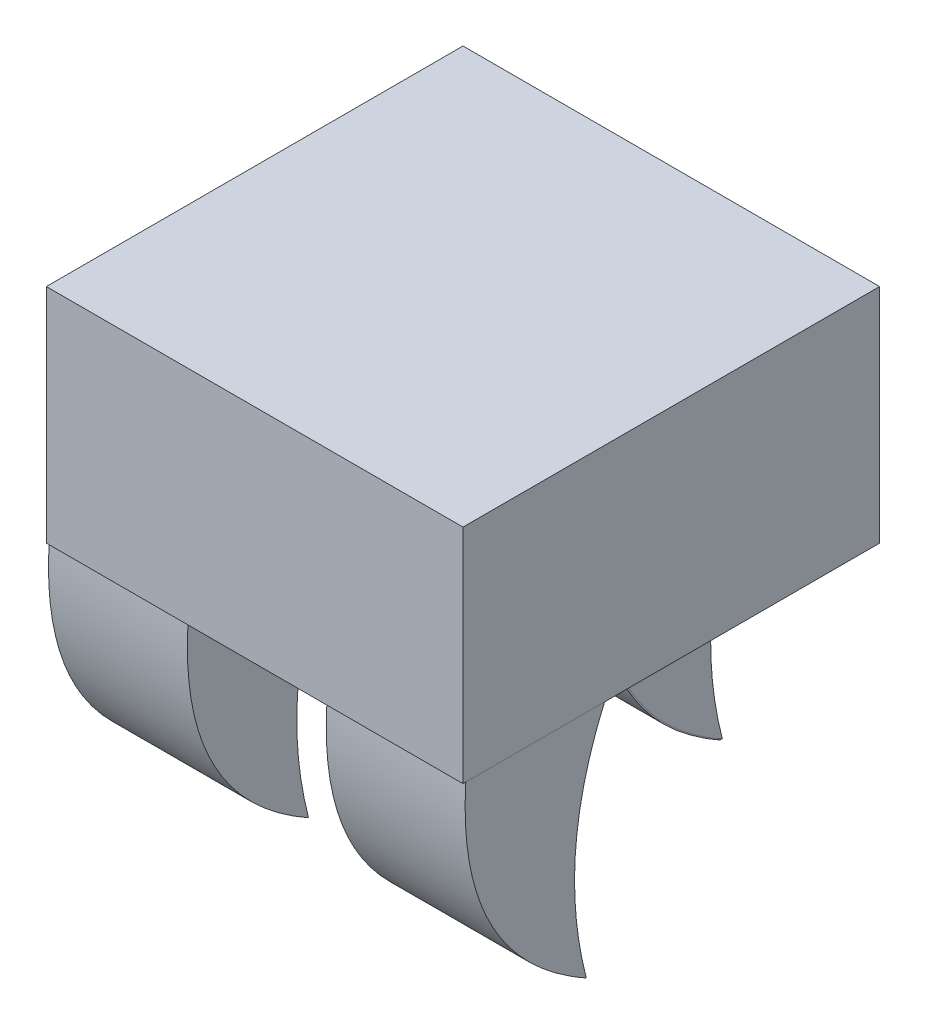
ISO-10303-21;
HEADER;
FILE_DESCRIPTION(('STEP AP214'),'2;1');
FILE_NAME('part.step','',(''),(''),'','','');
FILE_SCHEMA(('AUTOMOTIVE_DESIGN { 1 0 10303 214 1 1 1 1 }'));
ENDSEC;
DATA;
#1=APPLICATION_CONTEXT('core data for automotive mechanical design processes');
#2=APPLICATION_PROTOCOL_DEFINITION('international standard','automotive_design',2000,#1);
#3=PRODUCT_CONTEXT('',#1,'mechanical');
#4=PRODUCT('Part','Part','',(#3));
#5=PRODUCT_RELATED_PRODUCT_CATEGORY('part','',(#4));
#6=PRODUCT_DEFINITION_FORMATION('','',#4);
#7=PRODUCT_DEFINITION_CONTEXT('part definition',#1,'design');
#8=PRODUCT_DEFINITION('design','',#6,#7);
#9=PRODUCT_DEFINITION_SHAPE('','',#8);
#10=(LENGTH_UNIT() NAMED_UNIT(*) SI_UNIT(.MILLI.,.METRE.));
#11=(NAMED_UNIT(*) PLANE_ANGLE_UNIT() SI_UNIT($,.RADIAN.));
#12=(NAMED_UNIT(*) SI_UNIT($,.STERADIAN.) SOLID_ANGLE_UNIT());
#13=UNCERTAINTY_MEASURE_WITH_UNIT(LENGTH_MEASURE(1.E-05),#10,'distance_accuracy_value','');
#14=(GEOMETRIC_REPRESENTATION_CONTEXT(3) GLOBAL_UNCERTAINTY_ASSIGNED_CONTEXT((#13)) GLOBAL_UNIT_ASSIGNED_CONTEXT((#10,
#11,#12)) REPRESENTATION_CONTEXT('',''));
#15=CARTESIAN_POINT('',(0.,0.,0.));
#16=DIRECTION('',(0.,0.,1.));
#17=DIRECTION('',(1.,0.,0.));
#18=AXIS2_PLACEMENT_3D('',#15,#16,#17);
#19=CARTESIAN_POINT('',(0.,-4.,0.));
#20=DIRECTION('',(0.,-1.,0.));
#21=DIRECTION('',(0.,0.,-1.));
#22=AXIS2_PLACEMENT_3D('',#19,#20,#21);
#23=PLANE('',#22);
#24=DIRECTION('',(0.,0.,1.));
#25=VECTOR('',#24,1.);
#26=CARTESIAN_POINT('',(-7.5,-4.,7.50000000000001));
#27=LINE('',#26,#25);
#28=CARTESIAN_POINT('',(-7.5,-4.,7.4000004032366));
#29=VERTEX_POINT('',#28);
#30=CARTESIAN_POINT('',(-7.5,-4.,7.50000000000001));
#31=VERTEX_POINT('',#30);
#32=EDGE_CURVE('E332',#29,#31,#27,.T.);
#33=ORIENTED_EDGE('',*,*,#32,.F.);
#34=DIRECTION('',(-1.,0.,0.));
#35=VECTOR('',#34,1.);
#36=CARTESIAN_POINT('',(-2.50004012317898,-4.,7.4000004032366));
#37=LINE('',#36,#35);
#38=CARTESIAN_POINT('',(-2.50004012317898,-4.,7.4000004032366));
#39=VERTEX_POINT('',#38);
#40=EDGE_CURVE('E612',#39,#29,#37,.T.);
#41=ORIENTED_EDGE('',*,*,#40,.F.);
#42=DIRECTION('',(0.,0.,1.));
#43=VECTOR('',#42,1.);
#44=CARTESIAN_POINT('',(-2.50004012317898,-4.,7.4000004032366));
#45=LINE('',#44,#43);
#46=CARTESIAN_POINT('',(-2.50004012317898,-4.,2.4000004032366));
#47=VERTEX_POINT('',#46);
#48=EDGE_CURVE('E613',#47,#39,#45,.T.);
#49=ORIENTED_EDGE('',*,*,#48,.F.);
#50=DIRECTION('',(-1.,0.,0.));
#51=VECTOR('',#50,1.);
#52=CARTESIAN_POINT('',(-2.50004012317898,-4.,2.4000004032366));
#53=LINE('',#52,#51);
#54=CARTESIAN_POINT('',(-7.5,-4.,2.4000004032366));
#55=VERTEX_POINT('',#54);
#56=EDGE_CURVE('E622',#47,#55,#53,.T.);
#57=ORIENTED_EDGE('',*,*,#56,.T.);
#58=CARTESIAN_POINT('',(-7.5,-4.,-7.49999999999999));
#59=VERTEX_POINT('',#58);
#60=EDGE_CURVE('E366',#59,#55,#27,.T.);
#61=ORIENTED_EDGE('',*,*,#60,.F.);
#62=DIRECTION('',(-1.,0.,0.));
#63=VECTOR('',#62,1.);
#64=CARTESIAN_POINT('',(-7.5,-4.,-7.49999999999999));
#65=LINE('',#64,#63);
#66=CARTESIAN_POINT('',(-2.5,-4.,-7.49999999999999));
#67=VERTEX_POINT('',#66);
#68=EDGE_CURVE('E333',#67,#59,#65,.T.);
#69=ORIENTED_EDGE('',*,*,#68,.F.);
#70=DIRECTION('',(0.,0.,1.));
#71=VECTOR('',#70,1.);
#72=CARTESIAN_POINT('',(-2.5,-4.,-2.49999999999999));
#73=LINE('',#72,#71);
#74=CARTESIAN_POINT('',(-2.5,-4.,-7.4399995967634));
#75=VERTEX_POINT('',#74);
#76=EDGE_CURVE('E282',#67,#75,#73,.T.);
#77=ORIENTED_EDGE('',*,*,#76,.T.);
#78=DIRECTION('',(-1.,0.,0.));
#79=VECTOR('',#78,1.);
#80=CARTESIAN_POINT('',(2.49995987682102,-4.,-7.4399995967634));
#81=LINE('',#80,#79);
#82=CARTESIAN_POINT('',(-2.50004012317898,-4.,-7.4399995967634));
#83=VERTEX_POINT('',#82);
#84=EDGE_CURVE('E266',#75,#83,#81,.T.);
#85=ORIENTED_EDGE('',*,*,#84,.T.);
#86=DIRECTION('',(0.,0.,1.));
#87=VECTOR('',#86,1.);
#88=CARTESIAN_POINT('',(-2.50004012317898,-4.,-2.4399995967634));
#89=LINE('',#88,#87);
#90=CARTESIAN_POINT('',(-2.50004012317898,-4.,-2.4399995967634));
#91=VERTEX_POINT('',#90);
#92=EDGE_CURVE('E259',#83,#91,#89,.T.);
#93=ORIENTED_EDGE('',*,*,#92,.T.);
#94=DIRECTION('',(-1.,0.,0.));
#95=VECTOR('',#94,1.);
#96=CARTESIAN_POINT('',(2.49995987682102,-4.,-2.4399995967634));
#97=LINE('',#96,#95);
#98=CARTESIAN_POINT('',(2.49995987682102,-4.,-2.4399995967634));
#99=VERTEX_POINT('',#98);
#100=EDGE_CURVE('E245',#99,#91,#97,.T.);
#101=ORIENTED_EDGE('',*,*,#100,.F.);
#102=DIRECTION('',(0.,0.,1.));
#103=VECTOR('',#102,1.);
#104=CARTESIAN_POINT('',(2.49995987682102,-4.,-2.4399995967634));
#105=LINE('',#104,#103);
#106=CARTESIAN_POINT('',(2.49995987682102,-4.,-2.49999999999999));
#107=VERTEX_POINT('',#106);
#108=EDGE_CURVE('E235',#107,#99,#105,.T.);
#109=ORIENTED_EDGE('',*,*,#108,.F.);
#110=DIRECTION('',(-1.,0.,0.));
#111=VECTOR('',#110,1.);
#112=CARTESIAN_POINT('',(2.5,-4.,-2.49999999999999));
#113=LINE('',#112,#111);
#114=CARTESIAN_POINT('',(2.5,-4.,-2.49999999999999));
#115=VERTEX_POINT('',#114);
#116=EDGE_CURVE('E346',#115,#107,#113,.T.);
#117=ORIENTED_EDGE('',*,*,#116,.F.);
#118=DIRECTION('',(0.,0.,1.));
#119=VECTOR('',#118,1.);
#120=CARTESIAN_POINT('',(2.5,-4.,-2.49999999999999));
#121=LINE('',#120,#119);
#122=CARTESIAN_POINT('',(2.5,-4.,-7.49999999999999));
#123=VERTEX_POINT('',#122);
#124=EDGE_CURVE('E337',#123,#115,#121,.T.);
#125=ORIENTED_EDGE('',*,*,#124,.F.);
#126=CARTESIAN_POINT('',(7.5,-4.,-7.49999999999999));
#127=VERTEX_POINT('',#126);
#128=EDGE_CURVE('E323',#127,#123,#65,.T.);
#129=ORIENTED_EDGE('',*,*,#128,.F.);
#130=DIRECTION('',(0.,0.,-1.));
#131=VECTOR('',#130,1.);
#132=CARTESIAN_POINT('',(7.5,-4.,7.50000000000001));
#133=LINE('',#132,#131);
#134=CARTESIAN_POINT('',(7.5,-4.,7.50000000000001));
#135=VERTEX_POINT('',#134);
#136=EDGE_CURVE('E348',#135,#127,#133,.T.);
#137=ORIENTED_EDGE('',*,*,#136,.F.);
#138=DIRECTION('',(1.,0.,0.));
#139=VECTOR('',#138,1.);
#140=CARTESIAN_POINT('',(-7.5,-4.,7.50000000000001));
#141=LINE('',#140,#139);
#142=EDGE_CURVE('E358',#31,#135,#141,.T.);
#143=ORIENTED_EDGE('',*,*,#142,.F.);
#144=EDGE_LOOP('',(#33,#41,#49,#57,#61,#69,#77,#85,#93,#101,#109,#117,#125,#129,#137,#143));
#145=FACE_BOUND('',#144,.T.);
#146=DIRECTION('',(-1.,0.,0.));
#147=VECTOR('',#146,1.);
#148=CARTESIAN_POINT('',(7.49995987682102,-4.,7.4000004032366));
#149=LINE('',#148,#147);
#150=CARTESIAN_POINT('',(7.49995987682102,-4.,7.4000004032366));
#151=VERTEX_POINT('',#150);
#152=CARTESIAN_POINT('',(2.49995987682102,-4.,7.4000004032366));
#153=VERTEX_POINT('',#152);
#154=EDGE_CURVE('E54',#151,#153,#149,.T.);
#155=ORIENTED_EDGE('',*,*,#154,.F.);
#156=DIRECTION('',(0.,0.,1.));
#157=VECTOR('',#156,1.);
#158=CARTESIAN_POINT('',(7.49995987682102,-4.,7.4000004032366));
#159=LINE('',#158,#157);
#160=CARTESIAN_POINT('',(7.49995987682102,-4.,2.4000004032366));
#161=VERTEX_POINT('',#160);
#162=EDGE_CURVE('E58',#161,#151,#159,.T.);
#163=ORIENTED_EDGE('',*,*,#162,.F.);
#164=DIRECTION('',(-1.,0.,0.));
#165=VECTOR('',#164,1.);
#166=CARTESIAN_POINT('',(7.49995987682102,-4.,2.4000004032366));
#167=LINE('',#166,#165);
#168=CARTESIAN_POINT('',(2.49995987682102,-4.,2.4000004032366));
#169=VERTEX_POINT('',#168);
#170=EDGE_CURVE('E168',#161,#169,#167,.T.);
#171=ORIENTED_EDGE('',*,*,#170,.T.);
#172=DIRECTION('',(0.,0.,1.));
#173=VECTOR('',#172,1.);
#174=CARTESIAN_POINT('',(2.49995987682102,-4.,7.4000004032366));
#175=LINE('',#174,#173);
#176=EDGE_CURVE('E175',#169,#153,#175,.T.);
#177=ORIENTED_EDGE('',*,*,#176,.T.);
#178=EDGE_LOOP('',(#155,#163,#171,#177));
#179=FACE_BOUND('',#178,.T.);
#180=ADVANCED_FACE('F37',(#145,#179),#23,.T.);
#181=CARTESIAN_POINT('',(2.5,-4.,-2.49999999999999));
#182=CARTESIAN_POINT('',(2.5,-9.66431357814637,-2.15281213437045));
#183=CARTESIAN_POINT('',(2.5,-12.2780815752041,-6.83794658172918));
#184=B_SPLINE_CURVE_WITH_KNOTS('',2,(#181,#182,#183),.UNSPECIFIED.,.F.,.F.,(3,3),(0.,1.),.UNSPECIFIED.);
#185=DIRECTION('',(-1.,0.,0.));
#186=VECTOR('',#185,1.);
#187=SURFACE_OF_LINEAR_EXTRUSION('',#184,#186);
#188=DIRECTION('',(-1.,0.,0.));
#189=VECTOR('',#188,1.);
#190=CARTESIAN_POINT('',(2.49995987682102,-12.2386494329551,-6.76785740176658));
#191=LINE('',#190,#189);
#192=CARTESIAN_POINT('',(-2.5,-12.2386494329552,-6.76785740176659));
#193=VERTEX_POINT('',#192);
#194=CARTESIAN_POINT('',(2.49995987682102,-12.2386494329582,-6.76785740176736));
#195=VERTEX_POINT('',#194);
#196=EDGE_CURVE('E272',#193,#195,#191,.F.);
#197=ORIENTED_EDGE('',*,*,#196,.F.);
#198=CARTESIAN_POINT('',(-2.5,-4.,-2.49999999999999));
#199=CARTESIAN_POINT('',(-2.5,-9.66431357814637,-2.15281213437045));
#200=CARTESIAN_POINT('',(-2.5,-12.2780815752041,-6.83794658172918));
#201=B_SPLINE_CURVE_WITH_KNOTS('',2,(#198,#199,#200),.UNSPECIFIED.,.F.,.F.,(3,3),(0.,1.),.UNSPECIFIED.);
#202=CARTESIAN_POINT('',(-2.5,-12.2780815752041,-6.83794658172918));
#203=VERTEX_POINT('',#202);
#204=EDGE_CURVE('E274',#193,#203,#201,.T.);
#205=ORIENTED_EDGE('',*,*,#204,.T.);
#206=DIRECTION('',(-1.,0.,0.));
#207=VECTOR('',#206,1.);
#208=CARTESIAN_POINT('',(2.5,-12.2780815752041,-6.83794658172918));
#209=LINE('',#208,#207);
#210=CARTESIAN_POINT('',(2.5,-12.2780815752041,-6.83794658172918));
#211=VERTEX_POINT('',#210);
#212=EDGE_CURVE('E345',#211,#203,#209,.T.);
#213=ORIENTED_EDGE('',*,*,#212,.F.);
#214=EDGE_CURVE('E275',#115,#211,#184,.T.);
#215=ORIENTED_EDGE('',*,*,#214,.F.);
#216=ORIENTED_EDGE('',*,*,#116,.T.);
#217=CARTESIAN_POINT('',(2.49995987682102,-4.,-2.49999999999999));
#218=CARTESIAN_POINT('',(2.49995987682102,-9.66431357814637,-2.15281213437045));
#219=CARTESIAN_POINT('',(2.49995987682102,-12.2780815752041,-6.83794658172918));
#220=B_SPLINE_CURVE_WITH_KNOTS('',2,(#217,#218,#219),.UNSPECIFIED.,.F.,.F.,(3,3),(0.,1.),.UNSPECIFIED.);
#221=EDGE_CURVE('E11',#195,#107,#220,.F.);
#222=ORIENTED_EDGE('',*,*,#221,.F.);
#223=EDGE_LOOP('',(#197,#205,#213,#215,#216,#222));
#224=FACE_BOUND('',#223,.T.);
#225=ADVANCED_FACE('F291',(#224),#187,.F.);
#226=CARTESIAN_POINT('',(-2.5,-8.90167718287421,-3.41089271261752));
#227=DIRECTION('',(-1.,0.,0.));
#228=DIRECTION('',(0.,0.,1.));
#229=AXIS2_PLACEMENT_3D('',#226,#227,#228);
#230=PLANE('',#229);
#231=ORIENTED_EDGE('',*,*,#204,.F.);
#232=CARTESIAN_POINT('',(-2.5,-12.2780815752041,-6.77794617849259));
#233=CARTESIAN_POINT('',(-2.5,-8.00965666554609,-5.67941161720318));
#234=CARTESIAN_POINT('',(-2.5,-4.,-7.4399995967634));
#235=B_SPLINE_CURVE_WITH_KNOTS('',2,(#232,#233,#234),.UNSPECIFIED.,.F.,.F.,(3,3),(0.,1.),.UNSPECIFIED.);
#236=EDGE_CURVE('E47',#193,#75,#235,.T.);
#237=ORIENTED_EDGE('',*,*,#236,.T.);
#238=ORIENTED_EDGE('',*,*,#76,.F.);
#239=CARTESIAN_POINT('',(-2.5,-12.2780815752041,-6.83794658172918));
#240=CARTESIAN_POINT('',(-2.5,-8.00965666554609,-5.73941202043977));
#241=CARTESIAN_POINT('',(-2.5,-4.,-7.49999999999999));
#242=B_SPLINE_CURVE_WITH_KNOTS('',2,(#239,#240,#241),.UNSPECIFIED.,.F.,.F.,(3,3),(0.,1.),.UNSPECIFIED.);
#243=EDGE_CURVE('E343',#203,#67,#242,.T.);
#244=ORIENTED_EDGE('',*,*,#243,.F.);
#245=EDGE_LOOP('',(#231,#237,#238,#244));
#246=FACE_BOUND('',#245,.T.);
#247=ADVANCED_FACE('F295',(#246),#230,.T.);
#248=CARTESIAN_POINT('',(7.5,4.,7.50000000000001));
#249=DIRECTION('',(-1.,0.,0.));
#250=DIRECTION('',(0.,0.,1.));
#251=AXIS2_PLACEMENT_3D('',#248,#249,#250);
#252=PLANE('',#251);
#253=ORIENTED_EDGE('',*,*,#136,.T.);
#254=DIRECTION('',(0.,-1.,0.));
#255=VECTOR('',#254,1.);
#256=CARTESIAN_POINT('',(7.5,4.,-7.49999999999999));
#257=LINE('',#256,#255);
#258=CARTESIAN_POINT('',(7.5,4.,-7.49999999999999));
#259=VERTEX_POINT('',#258);
#260=EDGE_CURVE('E329',#259,#127,#257,.T.);
#261=ORIENTED_EDGE('',*,*,#260,.F.);
#262=DIRECTION('',(0.,0.,-1.));
#263=VECTOR('',#262,1.);
#264=CARTESIAN_POINT('',(7.5,4.,7.50000000000001));
#265=LINE('',#264,#263);
#266=CARTESIAN_POINT('',(7.5,4.,7.50000000000001));
#267=VERTEX_POINT('',#266);
#268=EDGE_CURVE('E354',#267,#259,#265,.T.);
#269=ORIENTED_EDGE('',*,*,#268,.F.);
#270=DIRECTION('',(0.,-1.,0.));
#271=VECTOR('',#270,1.);
#272=CARTESIAN_POINT('',(7.5,4.,7.50000000000001));
#273=LINE('',#272,#271);
#274=EDGE_CURVE('E364',#267,#135,#273,.T.);
#275=ORIENTED_EDGE('',*,*,#274,.T.);
#276=EDGE_LOOP('',(#253,#261,#269,#275));
#277=FACE_BOUND('',#276,.T.);
#278=ADVANCED_FACE('F39',(#277),#252,.F.);
#279=CARTESIAN_POINT('',(-7.5,4.,-7.49999999999999));
#280=DIRECTION('',(0.,0.,1.));
#281=DIRECTION('',(1.,0.,0.));
#282=AXIS2_PLACEMENT_3D('',#279,#280,#281);
#283=PLANE('',#282);
#284=ORIENTED_EDGE('',*,*,#128,.T.);
#285=DIRECTION('',(-1.,0.,0.));
#286=VECTOR('',#285,1.);
#287=CARTESIAN_POINT('',(2.5,-4.,-7.49999999999999));
#288=LINE('',#287,#286);
#289=EDGE_CURVE('E326',#123,#67,#288,.T.);
#290=ORIENTED_EDGE('',*,*,#289,.T.);
#291=ORIENTED_EDGE('',*,*,#68,.T.);
#292=DIRECTION('',(0.,-1.,0.));
#293=VECTOR('',#292,1.);
#294=CARTESIAN_POINT('',(-7.5,4.,-7.49999999999999));
#295=LINE('',#294,#293);
#296=CARTESIAN_POINT('',(-7.5,4.,-7.49999999999999));
#297=VERTEX_POINT('',#296);
#298=EDGE_CURVE('E376',#297,#59,#295,.T.);
#299=ORIENTED_EDGE('',*,*,#298,.F.);
#300=DIRECTION('',(-1.,0.,0.));
#301=VECTOR('',#300,1.);
#302=CARTESIAN_POINT('',(-7.5,4.,-7.49999999999999));
#303=LINE('',#302,#301);
#304=EDGE_CURVE('E357',#259,#297,#303,.T.);
#305=ORIENTED_EDGE('',*,*,#304,.F.);
#306=ORIENTED_EDGE('',*,*,#260,.T.);
#307=EDGE_LOOP('',(#284,#290,#291,#299,#305,#306));
#308=FACE_BOUND('',#307,.T.);
#309=ADVANCED_FACE('F312',(#308),#283,.F.);
#310=CARTESIAN_POINT('',(-7.5,4.,7.50000000000001));
#311=DIRECTION('',(1.,0.,0.));
#312=DIRECTION('',(0.,0.,-1.));
#313=AXIS2_PLACEMENT_3D('',#310,#311,#312);
#314=PLANE('',#313);
#315=ORIENTED_EDGE('',*,*,#60,.T.);
#316=EDGE_CURVE('E369',#55,#29,#27,.T.);
#317=ORIENTED_EDGE('',*,*,#316,.T.);
#318=ORIENTED_EDGE('',*,*,#32,.T.);
#319=DIRECTION('',(0.,-1.,0.));
#320=VECTOR('',#319,1.);
#321=CARTESIAN_POINT('',(-7.5,4.,7.50000000000001));
#322=LINE('',#321,#320);
#323=CARTESIAN_POINT('',(-7.5,4.,7.50000000000001));
#324=VERTEX_POINT('',#323);
#325=EDGE_CURVE('E373',#324,#31,#322,.T.);
#326=ORIENTED_EDGE('',*,*,#325,.F.);
#327=DIRECTION('',(0.,0.,1.));
#328=VECTOR('',#327,1.);
#329=CARTESIAN_POINT('',(-7.5,4.,7.50000000000001));
#330=LINE('',#329,#328);
#331=EDGE_CURVE('E360',#297,#324,#330,.T.);
#332=ORIENTED_EDGE('',*,*,#331,.F.);
#333=ORIENTED_EDGE('',*,*,#298,.T.);
#334=EDGE_LOOP('',(#315,#317,#318,#326,#332,#333));
#335=FACE_BOUND('',#334,.T.);
#336=ADVANCED_FACE('F309',(#335),#314,.F.);
#337=CARTESIAN_POINT('',(-7.5,4.,7.50000000000001));
#338=DIRECTION('',(0.,0.,-1.));
#339=DIRECTION('',(-1.,0.,0.));
#340=AXIS2_PLACEMENT_3D('',#337,#338,#339);
#341=PLANE('',#340);
#342=ORIENTED_EDGE('',*,*,#142,.T.);
#343=ORIENTED_EDGE('',*,*,#274,.F.);
#344=DIRECTION('',(1.,0.,0.));
#345=VECTOR('',#344,1.);
#346=CARTESIAN_POINT('',(-7.5,4.,7.50000000000001));
#347=LINE('',#346,#345);
#348=EDGE_CURVE('E362',#324,#267,#347,.T.);
#349=ORIENTED_EDGE('',*,*,#348,.F.);
#350=ORIENTED_EDGE('',*,*,#325,.T.);
#351=EDGE_LOOP('',(#342,#343,#349,#350));
#352=FACE_BOUND('',#351,.T.);
#353=ADVANCED_FACE('F302',(#352),#341,.F.);
#354=CARTESIAN_POINT('',(0.,4.,0.));
#355=DIRECTION('',(0.,-1.,0.));
#356=DIRECTION('',(0.,0.,-1.));
#357=AXIS2_PLACEMENT_3D('',#354,#355,#356);
#358=PLANE('',#357);
#359=ORIENTED_EDGE('',*,*,#268,.T.);
#360=ORIENTED_EDGE('',*,*,#304,.T.);
#361=ORIENTED_EDGE('',*,*,#331,.T.);
#362=ORIENTED_EDGE('',*,*,#348,.T.);
#363=EDGE_LOOP('',(#359,#360,#361,#362));
#364=FACE_BOUND('',#363,.T.);
#365=ADVANCED_FACE('F299',(#364),#358,.F.);
#366=CARTESIAN_POINT('',(2.5,-12.2780815752041,-6.83794658172918));
#367=CARTESIAN_POINT('',(2.5,-8.00965666554609,-5.73941202043977));
#368=CARTESIAN_POINT('',(2.5,-4.,-7.49999999999999));
#369=B_SPLINE_CURVE_WITH_KNOTS('',2,(#366,#367,#368),.UNSPECIFIED.,.F.,.F.,(3,3),(0.,1.),.UNSPECIFIED.);
#370=DIRECTION('',(-1.,0.,0.));
#371=VECTOR('',#370,1.);
#372=SURFACE_OF_LINEAR_EXTRUSION('',#369,#371);
#373=ORIENTED_EDGE('',*,*,#243,.T.);
#374=ORIENTED_EDGE('',*,*,#289,.F.);
#375=EDGE_CURVE('E281',#211,#123,#369,.T.);
#376=ORIENTED_EDGE('',*,*,#375,.F.);
#377=ORIENTED_EDGE('',*,*,#212,.T.);
#378=EDGE_LOOP('',(#373,#374,#376,#377));
#379=FACE_BOUND('',#378,.T.);
#380=ADVANCED_FACE('F297',(#379),#372,.F.);
#381=CARTESIAN_POINT('',(2.5,-8.90167718287421,-3.41089271261752));
#382=DIRECTION('',(-1.,0.,0.));
#383=DIRECTION('',(0.,0.,1.));
#384=AXIS2_PLACEMENT_3D('',#381,#382,#383);
#385=PLANE('',#384);
#386=ORIENTED_EDGE('',*,*,#214,.T.);
#387=ORIENTED_EDGE('',*,*,#375,.T.);
#388=ORIENTED_EDGE('',*,*,#124,.T.);
#389=EDGE_LOOP('',(#386,#387,#388));
#390=FACE_BOUND('',#389,.T.);
#391=ADVANCED_FACE('F216',(#390),#385,.F.);
#392=CARTESIAN_POINT('',(2.49995987682102,-8.90167718287421,-3.35089230938093));
#393=DIRECTION('',(-1.,0.,0.));
#394=DIRECTION('',(0.,0.,1.));
#395=AXIS2_PLACEMENT_3D('',#392,#393,#394);
#396=PLANE('',#395);
#397=CARTESIAN_POINT('',(2.49995987682102,-12.2780815752041,-6.77794617849259));
#398=CARTESIAN_POINT('',(2.49995987682102,-8.00965666554609,-5.67941161720318));
#399=CARTESIAN_POINT('',(2.49995987682102,-4.,-7.4399995967634));
#400=B_SPLINE_CURVE_WITH_KNOTS('',2,(#397,#398,#399),.UNSPECIFIED.,.F.,.F.,(3,3),(0.,1.),.UNSPECIFIED.);
#401=CARTESIAN_POINT('',(2.49995987682102,-12.2780815752041,-6.77794617849259));
#402=VERTEX_POINT('',#401);
#403=EDGE_CURVE('E229',#402,#195,#400,.T.);
#404=ORIENTED_EDGE('',*,*,#403,.T.);
#405=ORIENTED_EDGE('',*,*,#221,.T.);
#406=ORIENTED_EDGE('',*,*,#108,.T.);
#407=CARTESIAN_POINT('',(2.49995987682102,-4.,-2.4399995967634));
#408=CARTESIAN_POINT('',(2.49995987682102,-9.66431357814637,-2.09281173113386));
#409=CARTESIAN_POINT('',(2.49995987682102,-12.2780815752041,-6.77794617849259));
#410=B_SPLINE_CURVE_WITH_KNOTS('',2,(#407,#408,#409),.UNSPECIFIED.,.F.,.F.,(3,3),(0.,1.),.UNSPECIFIED.);
#411=EDGE_CURVE('E236',#99,#402,#410,.T.);
#412=ORIENTED_EDGE('',*,*,#411,.T.);
#413=EDGE_LOOP('',(#404,#405,#406,#412));
#414=FACE_BOUND('',#413,.T.);
#415=ADVANCED_FACE('F212',(#414),#396,.F.);
#416=DIRECTION('',(-1.,0.,0.));
#417=VECTOR('',#416,1.);
#418=SURFACE_OF_LINEAR_EXTRUSION('',#400,#417);
#419=ORIENTED_EDGE('',*,*,#236,.F.);
#420=ORIENTED_EDGE('',*,*,#196,.T.);
#421=ORIENTED_EDGE('',*,*,#403,.F.);
#422=DIRECTION('',(-1.,0.,0.));
#423=VECTOR('',#422,1.);
#424=CARTESIAN_POINT('',(2.49995987682102,-12.2780815752041,-6.77794617849259));
#425=LINE('',#424,#423);
#426=CARTESIAN_POINT('',(-2.50004012317898,-12.2780815752041,-6.77794617849259));
#427=VERTEX_POINT('',#426);
#428=EDGE_CURVE('E269',#402,#427,#425,.T.);
#429=ORIENTED_EDGE('',*,*,#428,.T.);
#430=CARTESIAN_POINT('',(-2.50004012317898,-12.2780815752041,-6.77794617849259));
#431=CARTESIAN_POINT('',(-2.50004012317898,-8.00965666554609,-5.67941161720318));
#432=CARTESIAN_POINT('',(-2.50004012317898,-4.,-7.4399995967634));
#433=B_SPLINE_CURVE_WITH_KNOTS('',2,(#430,#431,#432),.UNSPECIFIED.,.F.,.F.,(3,3),(0.,1.),.UNSPECIFIED.);
#434=EDGE_CURVE('E251',#427,#83,#433,.T.);
#435=ORIENTED_EDGE('',*,*,#434,.T.);
#436=ORIENTED_EDGE('',*,*,#84,.F.);
#437=EDGE_LOOP('',(#419,#420,#421,#429,#435,#436));
#438=FACE_BOUND('',#437,.T.);
#439=ADVANCED_FACE('F215',(#438),#418,.F.);
#440=DIRECTION('',(-1.,0.,0.));
#441=VECTOR('',#440,1.);
#442=SURFACE_OF_LINEAR_EXTRUSION('',#410,#441);
#443=CARTESIAN_POINT('',(-2.50004012317898,-4.,-2.4399995967634));
#444=CARTESIAN_POINT('',(-2.50004012317898,-9.66431357814637,-2.09281173113386));
#445=CARTESIAN_POINT('',(-2.50004012317898,-12.2780815752041,-6.77794617849259));
#446=B_SPLINE_CURVE_WITH_KNOTS('',2,(#443,#444,#445),.UNSPECIFIED.,.F.,.F.,(3,3),(0.,1.),.UNSPECIFIED.);
#447=EDGE_CURVE('E246',#91,#427,#446,.T.);
#448=ORIENTED_EDGE('',*,*,#447,.T.);
#449=ORIENTED_EDGE('',*,*,#428,.F.);
#450=ORIENTED_EDGE('',*,*,#411,.F.);
#451=ORIENTED_EDGE('',*,*,#100,.T.);
#452=EDGE_LOOP('',(#448,#449,#450,#451));
#453=FACE_BOUND('',#452,.T.);
#454=ADVANCED_FACE('F221',(#453),#442,.F.);
#455=CARTESIAN_POINT('',(-2.50004012317898,-8.90167718287421,-3.35089230938093));
#456=DIRECTION('',(-1.,0.,0.));
#457=DIRECTION('',(0.,0.,1.));
#458=AXIS2_PLACEMENT_3D('',#455,#456,#457);
#459=PLANE('',#458);
#460=ORIENTED_EDGE('',*,*,#447,.F.);
#461=ORIENTED_EDGE('',*,*,#92,.F.);
#462=ORIENTED_EDGE('',*,*,#434,.F.);
#463=EDGE_LOOP('',(#460,#461,#462));
#464=FACE_BOUND('',#463,.T.);
#465=ADVANCED_FACE('F218',(#464),#459,.T.);
#466=CARTESIAN_POINT('',(-2.50004012317898,-4.,7.4000004032366));
#467=DIRECTION('',(0.,-1.,0.));
#468=DIRECTION('',(0.,0.,-1.));
#469=AXIS2_PLACEMENT_3D('',#466,#467,#468);
#470=PLANE('',#469);
#471=CARTESIAN_POINT('',(-7.50004012317898,-4.,7.4000004032366));
#472=VERTEX_POINT('',#471);
#473=EDGE_CURVE('E610',#29,#472,#37,.T.);
#474=ORIENTED_EDGE('',*,*,#473,.F.);
#475=ORIENTED_EDGE('',*,*,#316,.F.);
#476=CARTESIAN_POINT('',(-7.50004012317898,-4.,2.4000004032366));
#477=VERTEX_POINT('',#476);
#478=EDGE_CURVE('E616',#55,#477,#53,.T.);
#479=ORIENTED_EDGE('',*,*,#478,.T.);
#480=DIRECTION('',(0.,0.,1.));
#481=VECTOR('',#480,1.);
#482=CARTESIAN_POINT('',(-7.50004012317898,-4.,7.4000004032366));
#483=LINE('',#482,#481);
#484=EDGE_CURVE('E195',#477,#472,#483,.T.);
#485=ORIENTED_EDGE('',*,*,#484,.T.);
#486=EDGE_LOOP('',(#474,#475,#479,#485));
#487=FACE_BOUND('',#486,.T.);
#488=ADVANCED_FACE('F209',(#487),#470,.F.);
#489=CARTESIAN_POINT('',(-2.50004012317898,-4.,7.4000004032366));
#490=CARTESIAN_POINT('',(-2.50004012317898,-9.66431357814637,7.74718826886614));
#491=CARTESIAN_POINT('',(-2.50004012317898,-12.2780815752041,3.06205382150741));
#492=B_SPLINE_CURVE_WITH_KNOTS('',2,(#489,#490,#491),.UNSPECIFIED.,.F.,.F.,(3,3),(0.,1.),.UNSPECIFIED.);
#493=DIRECTION('',(-1.,0.,0.));
#494=VECTOR('',#493,1.);
#495=SURFACE_OF_LINEAR_EXTRUSION('',#492,#494);
#496=CARTESIAN_POINT('',(-7.50004012317898,-4.,7.4000004032366));
#497=CARTESIAN_POINT('',(-7.50004012317898,-9.66431357814637,7.74718826886614));
#498=CARTESIAN_POINT('',(-7.50004012317898,-12.2780815752041,3.06205382150741));
#499=B_SPLINE_CURVE_WITH_KNOTS('',2,(#496,#497,#498),.UNSPECIFIED.,.F.,.F.,(3,3),(0.,1.),.UNSPECIFIED.);
#500=CARTESIAN_POINT('',(-7.50004012317898,-12.2780815752041,3.06205382150741));
#501=VERTEX_POINT('',#500);
#502=EDGE_CURVE('E180',#472,#501,#499,.T.);
#503=ORIENTED_EDGE('',*,*,#502,.T.);
#504=DIRECTION('',(-1.,0.,0.));
#505=VECTOR('',#504,1.);
#506=CARTESIAN_POINT('',(-2.50004012317898,-12.2780815752041,3.06205382150741));
#507=LINE('',#506,#505);
#508=CARTESIAN_POINT('',(-2.50004012317898,-12.2780815752041,3.06205382150741));
#509=VERTEX_POINT('',#508);
#510=EDGE_CURVE('E252',#509,#501,#507,.T.);
#511=ORIENTED_EDGE('',*,*,#510,.F.);
#512=EDGE_CURVE('E188',#39,#509,#492,.T.);
#513=ORIENTED_EDGE('',*,*,#512,.F.);
#514=ORIENTED_EDGE('',*,*,#40,.T.);
#515=ORIENTED_EDGE('',*,*,#473,.T.);
#516=EDGE_LOOP('',(#503,#511,#513,#514,#515));
#517=FACE_BOUND('',#516,.T.);
#518=ADVANCED_FACE('F204',(#517),#495,.F.);
#519=CARTESIAN_POINT('',(-2.50004012317898,-12.2780815752041,3.06205382150741));
#520=CARTESIAN_POINT('',(-2.50004012317898,-8.00965666554609,4.16058838279682));
#521=CARTESIAN_POINT('',(-2.50004012317898,-4.,2.4000004032366));
#522=B_SPLINE_CURVE_WITH_KNOTS('',2,(#519,#520,#521),.UNSPECIFIED.,.F.,.F.,(3,3),(0.,1.),.UNSPECIFIED.);
#523=DIRECTION('',(-1.,0.,0.));
#524=VECTOR('',#523,1.);
#525=SURFACE_OF_LINEAR_EXTRUSION('',#522,#524);
#526=CARTESIAN_POINT('',(-7.50004012317898,-12.2780815752041,3.06205382150741));
#527=CARTESIAN_POINT('',(-7.50004012317898,-8.00965666554609,4.16058838279682));
#528=CARTESIAN_POINT('',(-7.50004012317898,-4.,2.4000004032366));
#529=B_SPLINE_CURVE_WITH_KNOTS('',2,(#526,#527,#528),.UNSPECIFIED.,.F.,.F.,(3,3),(0.,1.),.UNSPECIFIED.);
#530=EDGE_CURVE('E183',#501,#477,#529,.T.);
#531=ORIENTED_EDGE('',*,*,#530,.T.);
#532=ORIENTED_EDGE('',*,*,#478,.F.);
#533=ORIENTED_EDGE('',*,*,#56,.F.);
#534=EDGE_CURVE('E194',#509,#47,#522,.T.);
#535=ORIENTED_EDGE('',*,*,#534,.F.);
#536=ORIENTED_EDGE('',*,*,#510,.T.);
#537=EDGE_LOOP('',(#531,#532,#533,#535,#536));
#538=FACE_BOUND('',#537,.T.);
#539=ADVANCED_FACE('F208',(#538),#525,.F.);
#540=CARTESIAN_POINT('',(-2.50004012317898,-8.90167718287421,6.48910769061907));
#541=DIRECTION('',(-1.,0.,0.));
#542=DIRECTION('',(0.,0.,1.));
#543=AXIS2_PLACEMENT_3D('',#540,#541,#542);
#544=PLANE('',#543);
#545=ORIENTED_EDGE('',*,*,#512,.T.);
#546=ORIENTED_EDGE('',*,*,#534,.T.);
#547=ORIENTED_EDGE('',*,*,#48,.T.);
#548=EDGE_LOOP('',(#545,#546,#547));
#549=FACE_BOUND('',#548,.T.);
#550=ADVANCED_FACE('F437',(#549),#544,.F.);
#551=CARTESIAN_POINT('',(-7.50004012317898,-8.90167718287421,6.48910769061907));
#552=DIRECTION('',(-1.,0.,0.));
#553=DIRECTION('',(0.,0.,1.));
#554=AXIS2_PLACEMENT_3D('',#551,#552,#553);
#555=PLANE('',#554);
#556=ORIENTED_EDGE('',*,*,#502,.F.);
#557=ORIENTED_EDGE('',*,*,#484,.F.);
#558=ORIENTED_EDGE('',*,*,#530,.F.);
#559=EDGE_LOOP('',(#556,#557,#558));
#560=FACE_BOUND('',#559,.T.);
#561=ADVANCED_FACE('F444',(#560),#555,.T.);
#562=CARTESIAN_POINT('',(7.49995987682102,-4.,7.4000004032366));
#563=CARTESIAN_POINT('',(7.49995987682102,-9.66431357814637,7.74718826886614));
#564=CARTESIAN_POINT('',(7.49995987682102,-12.2780815752041,3.06205382150741));
#565=B_SPLINE_CURVE_WITH_KNOTS('',2,(#562,#563,#564),.UNSPECIFIED.,.F.,.F.,(3,3),(0.,1.),.UNSPECIFIED.);
#566=DIRECTION('',(-1.,0.,0.));
#567=VECTOR('',#566,1.);
#568=SURFACE_OF_LINEAR_EXTRUSION('',#565,#567);
#569=CARTESIAN_POINT('',(2.49995987682102,-4.,7.4000004032366));
#570=CARTESIAN_POINT('',(2.49995987682102,-9.66431357814637,7.74718826886614));
#571=CARTESIAN_POINT('',(2.49995987682102,-12.2780815752041,3.06205382150741));
#572=B_SPLINE_CURVE_WITH_KNOTS('',2,(#569,#570,#571),.UNSPECIFIED.,.F.,.F.,(3,3),(0.,1.),.UNSPECIFIED.);
#573=CARTESIAN_POINT('',(2.49995987682102,-12.2780815752041,3.06205382150741));
#574=VERTEX_POINT('',#573);
#575=EDGE_CURVE('E179',#153,#574,#572,.T.);
#576=ORIENTED_EDGE('',*,*,#575,.T.);
#577=DIRECTION('',(-1.,0.,0.));
#578=VECTOR('',#577,1.);
#579=CARTESIAN_POINT('',(7.49995987682102,-12.2780815752041,3.06205382150741));
#580=LINE('',#579,#578);
#581=CARTESIAN_POINT('',(7.49995987682102,-12.2780815752041,3.06205382150741));
#582=VERTEX_POINT('',#581);
#583=EDGE_CURVE('E166',#582,#574,#580,.T.);
#584=ORIENTED_EDGE('',*,*,#583,.F.);
#585=EDGE_CURVE('E170',#151,#582,#565,.T.);
#586=ORIENTED_EDGE('',*,*,#585,.F.);
#587=ORIENTED_EDGE('',*,*,#154,.T.);
#588=EDGE_LOOP('',(#576,#584,#586,#587));
#589=FACE_BOUND('',#588,.T.);
#590=ADVANCED_FACE('F177',(#589),#568,.F.);
#591=CARTESIAN_POINT('',(7.49995987682102,-12.2780815752041,3.06205382150741));
#592=CARTESIAN_POINT('',(7.49995987682102,-8.00965666554609,4.16058838279682));
#593=CARTESIAN_POINT('',(7.49995987682102,-4.,2.4000004032366));
#594=B_SPLINE_CURVE_WITH_KNOTS('',2,(#591,#592,#593),.UNSPECIFIED.,.F.,.F.,(3,3),(0.,1.),.UNSPECIFIED.);
#595=DIRECTION('',(-1.,0.,0.));
#596=VECTOR('',#595,1.);
#597=SURFACE_OF_LINEAR_EXTRUSION('',#594,#596);
#598=CARTESIAN_POINT('',(2.49995987682102,-12.2780815752041,3.06205382150741));
#599=CARTESIAN_POINT('',(2.49995987682102,-8.00965666554609,4.16058838279682));
#600=CARTESIAN_POINT('',(2.49995987682102,-4.,2.4000004032366));
#601=B_SPLINE_CURVE_WITH_KNOTS('',2,(#598,#599,#600),.UNSPECIFIED.,.F.,.F.,(3,3),(0.,1.),.UNSPECIFIED.);
#602=EDGE_CURVE('E588',#574,#169,#601,.T.);
#603=ORIENTED_EDGE('',*,*,#602,.T.);
#604=ORIENTED_EDGE('',*,*,#170,.F.);
#605=EDGE_CURVE('E161',#582,#161,#594,.T.);
#606=ORIENTED_EDGE('',*,*,#605,.F.);
#607=ORIENTED_EDGE('',*,*,#583,.T.);
#608=EDGE_LOOP('',(#603,#604,#606,#607));
#609=FACE_BOUND('',#608,.T.);
#610=ADVANCED_FACE('F164',(#609),#597,.F.);
#611=CARTESIAN_POINT('',(7.49995987682102,-8.90167718287421,6.48910769061907));
#612=DIRECTION('',(-1.,0.,0.));
#613=DIRECTION('',(0.,0.,1.));
#614=AXIS2_PLACEMENT_3D('',#611,#612,#613);
#615=PLANE('',#614);
#616=ORIENTED_EDGE('',*,*,#585,.T.);
#617=ORIENTED_EDGE('',*,*,#605,.T.);
#618=ORIENTED_EDGE('',*,*,#162,.T.);
#619=EDGE_LOOP('',(#616,#617,#618));
#620=FACE_BOUND('',#619,.T.);
#621=ADVANCED_FACE('F173',(#620),#615,.F.);
#622=CARTESIAN_POINT('',(2.49995987682102,-8.90167718287421,6.48910769061907));
#623=DIRECTION('',(-1.,0.,0.));
#624=DIRECTION('',(0.,0.,1.));
#625=AXIS2_PLACEMENT_3D('',#622,#623,#624);
#626=PLANE('',#625);
#627=ORIENTED_EDGE('',*,*,#575,.F.);
#628=ORIENTED_EDGE('',*,*,#176,.F.);
#629=ORIENTED_EDGE('',*,*,#602,.F.);
#630=EDGE_LOOP('',(#627,#628,#629));
#631=FACE_BOUND('',#630,.T.);
#632=ADVANCED_FACE('F471',(#631),#626,.T.);
#633=CLOSED_SHELL('',(#180,#225,#247,#278,#309,#336,#353,#365,#380,#391,#415,#439,#454,#465,
#488,#518,#539,#550,#561,#590,#610,#621,#632));
#634=MANIFOLD_SOLID_BREP('B2',#633);
#635=ADVANCED_BREP_SHAPE_REPRESENTATION('',(#18,#634),#14);
#636=SHAPE_DEFINITION_REPRESENTATION(#9,#635);
ENDSEC;
END-ISO-10303-21;
